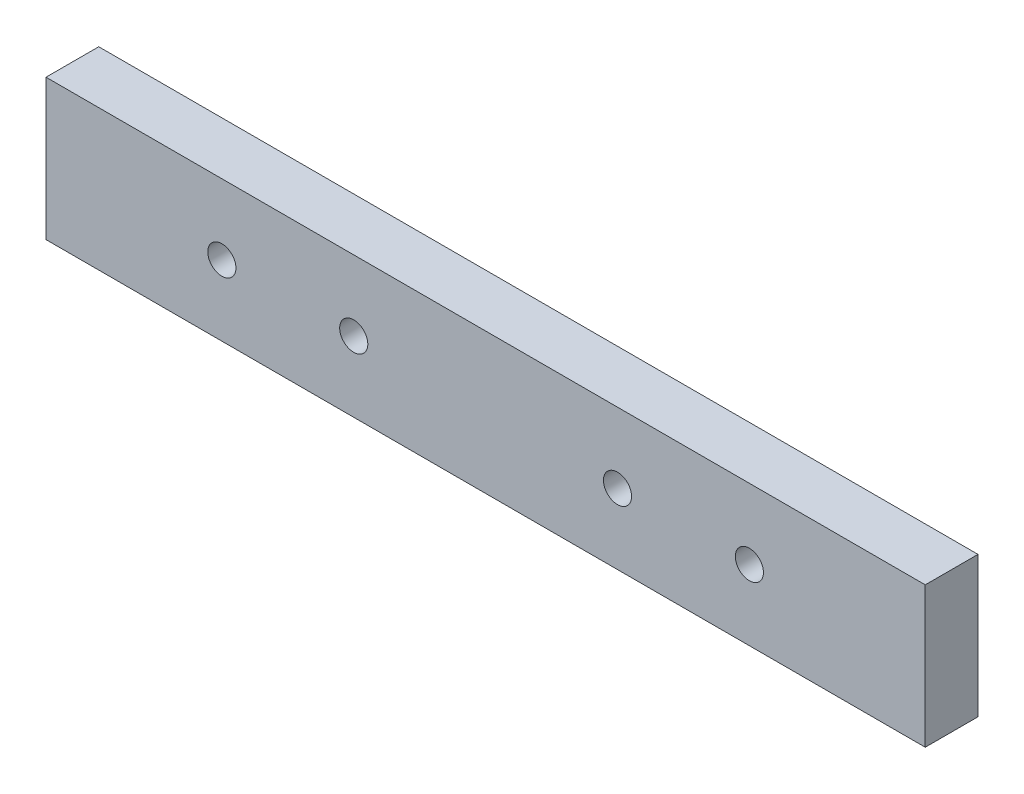
ISO-10303-21;
HEADER;
FILE_DESCRIPTION(('STEP AP214'),'2;1');
FILE_NAME('part.step','',(''),(''),'','','');
FILE_SCHEMA(('AUTOMOTIVE_DESIGN { 1 0 10303 214 1 1 1 1 }'));
ENDSEC;
DATA;
#1=APPLICATION_CONTEXT('core data for automotive mechanical design processes');
#2=APPLICATION_PROTOCOL_DEFINITION('international standard','automotive_design',2000,#1);
#3=PRODUCT_CONTEXT('',#1,'mechanical');
#4=PRODUCT('Part','Part','',(#3));
#5=PRODUCT_RELATED_PRODUCT_CATEGORY('part','',(#4));
#6=PRODUCT_DEFINITION_FORMATION('','',#4);
#7=PRODUCT_DEFINITION_CONTEXT('part definition',#1,'design');
#8=PRODUCT_DEFINITION('design','',#6,#7);
#9=PRODUCT_DEFINITION_SHAPE('','',#8);
#10=(LENGTH_UNIT() NAMED_UNIT(*) SI_UNIT(.MILLI.,.METRE.));
#11=(NAMED_UNIT(*) PLANE_ANGLE_UNIT() SI_UNIT($,.RADIAN.));
#12=(NAMED_UNIT(*) SI_UNIT($,.STERADIAN.) SOLID_ANGLE_UNIT());
#13=UNCERTAINTY_MEASURE_WITH_UNIT(LENGTH_MEASURE(1.E-05),#10,'distance_accuracy_value','');
#14=(GEOMETRIC_REPRESENTATION_CONTEXT(3) GLOBAL_UNCERTAINTY_ASSIGNED_CONTEXT((#13)) GLOBAL_UNIT_ASSIGNED_CONTEXT((#10,
#11,#12)) REPRESENTATION_CONTEXT('',''));
#15=CARTESIAN_POINT('',(0.,0.,0.));
#16=DIRECTION('',(0.,0.,1.));
#17=DIRECTION('',(1.,0.,0.));
#18=AXIS2_PLACEMENT_3D('',#15,#16,#17);
#19=CARTESIAN_POINT('',(0.,0.,6.));
#20=DIRECTION('',(0.,0.,1.));
#21=DIRECTION('',(1.,0.,0.));
#22=AXIS2_PLACEMENT_3D('',#19,#20,#21);
#23=PLANE('',#22);
#24=CARTESIAN_POINT('',(-30.,0.,6.));
#25=DIRECTION('',(0.,0.,1.));
#26=DIRECTION('',(-1.,0.,0.));
#27=AXIS2_PLACEMENT_3D('',#24,#25,#26);
#28=CIRCLE('',#27,1.6);
#29=CARTESIAN_POINT('',(-31.6,0.,6.));
#30=VERTEX_POINT('',#29);
#31=EDGE_CURVE('E123',#30,#30,#28,.T.);
#32=ORIENTED_EDGE('',*,*,#31,.F.);
#33=EDGE_LOOP('',(#32));
#34=FACE_BOUND('',#33,.T.);
#35=CARTESIAN_POINT('',(30.,0.,6.));
#36=DIRECTION('',(0.,0.,1.));
#37=DIRECTION('',(1.,0.,0.));
#38=AXIS2_PLACEMENT_3D('',#35,#36,#37);
#39=CIRCLE('',#38,1.6);
#40=CARTESIAN_POINT('',(31.6,0.,6.));
#41=VERTEX_POINT('',#40);
#42=EDGE_CURVE('E102',#41,#41,#39,.T.);
#43=ORIENTED_EDGE('',*,*,#42,.F.);
#44=EDGE_LOOP('',(#43));
#45=FACE_BOUND('',#44,.T.);
#46=DIRECTION('',(0.,1.,0.));
#47=VECTOR('',#46,1.);
#48=CARTESIAN_POINT('',(50.,8.00000000000001,6.));
#49=LINE('',#48,#47);
#50=CARTESIAN_POINT('',(50.,-7.99999999999999,6.));
#51=VERTEX_POINT('',#50);
#52=CARTESIAN_POINT('',(50.,8.00000000000001,6.));
#53=VERTEX_POINT('',#52);
#54=EDGE_CURVE('E87',#51,#53,#49,.T.);
#55=ORIENTED_EDGE('',*,*,#54,.T.);
#56=DIRECTION('',(-1.,0.,0.));
#57=VECTOR('',#56,1.);
#58=CARTESIAN_POINT('',(-50.,8.00000000000001,6.));
#59=LINE('',#58,#57);
#60=CARTESIAN_POINT('',(-50.,8.00000000000001,6.));
#61=VERTEX_POINT('',#60);
#62=EDGE_CURVE('E82',#53,#61,#59,.T.);
#63=ORIENTED_EDGE('',*,*,#62,.T.);
#64=DIRECTION('',(0.,-1.,0.));
#65=VECTOR('',#64,1.);
#66=CARTESIAN_POINT('',(-50.,8.00000000000001,6.));
#67=LINE('',#66,#65);
#68=CARTESIAN_POINT('',(-50.,-7.99999999999999,6.));
#69=VERTEX_POINT('',#68);
#70=EDGE_CURVE('E85',#61,#69,#67,.T.);
#71=ORIENTED_EDGE('',*,*,#70,.T.);
#72=DIRECTION('',(1.,0.,0.));
#73=VECTOR('',#72,1.);
#74=CARTESIAN_POINT('',(-50.,-7.99999999999999,6.));
#75=LINE('',#74,#73);
#76=EDGE_CURVE('E52',#69,#51,#75,.T.);
#77=ORIENTED_EDGE('',*,*,#76,.T.);
#78=EDGE_LOOP('',(#55,#63,#71,#77));
#79=FACE_BOUND('',#78,.T.);
#80=CARTESIAN_POINT('',(15.,0.,6.));
#81=DIRECTION('',(0.,0.,1.));
#82=DIRECTION('',(1.,0.,0.));
#83=AXIS2_PLACEMENT_3D('',#80,#81,#82);
#84=CIRCLE('',#83,1.6);
#85=CARTESIAN_POINT('',(16.6,0.,6.));
#86=VERTEX_POINT('',#85);
#87=EDGE_CURVE('E117',#86,#86,#84,.T.);
#88=ORIENTED_EDGE('',*,*,#87,.F.);
#89=EDGE_LOOP('',(#88));
#90=FACE_BOUND('',#89,.T.);
#91=CARTESIAN_POINT('',(-15.,0.,6.));
#92=DIRECTION('',(0.,0.,1.));
#93=DIRECTION('',(-1.,0.,0.));
#94=AXIS2_PLACEMENT_3D('',#91,#92,#93);
#95=CIRCLE('',#94,1.6);
#96=CARTESIAN_POINT('',(-16.6,0.,6.));
#97=VERTEX_POINT('',#96);
#98=EDGE_CURVE('E129',#97,#97,#95,.T.);
#99=ORIENTED_EDGE('',*,*,#98,.F.);
#100=EDGE_LOOP('',(#99));
#101=FACE_BOUND('',#100,.T.);
#102=ADVANCED_FACE('F35',(#34,#45,#79,#90,#101),#23,.T.);
#103=CARTESIAN_POINT('',(0.,0.,0.));
#104=DIRECTION('',(0.,0.,1.));
#105=DIRECTION('',(1.,0.,0.));
#106=AXIS2_PLACEMENT_3D('',#103,#104,#105);
#107=PLANE('',#106);
#108=DIRECTION('',(0.,1.,0.));
#109=VECTOR('',#108,1.);
#110=CARTESIAN_POINT('',(50.,8.00000000000001,0.));
#111=LINE('',#110,#109);
#112=CARTESIAN_POINT('',(50.,-7.99999999999999,0.));
#113=VERTEX_POINT('',#112);
#114=CARTESIAN_POINT('',(50.,8.00000000000001,0.));
#115=VERTEX_POINT('',#114);
#116=EDGE_CURVE('E99',#113,#115,#111,.T.);
#117=ORIENTED_EDGE('',*,*,#116,.F.);
#118=DIRECTION('',(1.,0.,0.));
#119=VECTOR('',#118,1.);
#120=CARTESIAN_POINT('',(-50.,-7.99999999999999,0.));
#121=LINE('',#120,#119);
#122=CARTESIAN_POINT('',(-50.,-7.99999999999999,0.));
#123=VERTEX_POINT('',#122);
#124=EDGE_CURVE('E75',#123,#113,#121,.T.);
#125=ORIENTED_EDGE('',*,*,#124,.F.);
#126=DIRECTION('',(0.,-1.,0.));
#127=VECTOR('',#126,1.);
#128=CARTESIAN_POINT('',(-50.,8.00000000000001,0.));
#129=LINE('',#128,#127);
#130=CARTESIAN_POINT('',(-50.,8.00000000000001,0.));
#131=VERTEX_POINT('',#130);
#132=EDGE_CURVE('E69',#131,#123,#129,.T.);
#133=ORIENTED_EDGE('',*,*,#132,.F.);
#134=DIRECTION('',(-1.,0.,0.));
#135=VECTOR('',#134,1.);
#136=CARTESIAN_POINT('',(-50.,8.00000000000001,0.));
#137=LINE('',#136,#135);
#138=EDGE_CURVE('E91',#115,#131,#137,.T.);
#139=ORIENTED_EDGE('',*,*,#138,.F.);
#140=EDGE_LOOP('',(#117,#125,#133,#139));
#141=FACE_BOUND('',#140,.T.);
#142=CARTESIAN_POINT('',(30.,0.,0.));
#143=DIRECTION('',(0.,0.,1.));
#144=DIRECTION('',(1.,0.,0.));
#145=AXIS2_PLACEMENT_3D('',#142,#143,#144);
#146=CIRCLE('',#145,1.6);
#147=CARTESIAN_POINT('',(31.6,0.,0.));
#148=VERTEX_POINT('',#147);
#149=EDGE_CURVE('E114',#148,#148,#146,.T.);
#150=ORIENTED_EDGE('',*,*,#149,.T.);
#151=EDGE_LOOP('',(#150));
#152=FACE_BOUND('',#151,.T.);
#153=CARTESIAN_POINT('',(15.,0.,0.));
#154=DIRECTION('',(0.,0.,1.));
#155=DIRECTION('',(1.,0.,0.));
#156=AXIS2_PLACEMENT_3D('',#153,#154,#155);
#157=CIRCLE('',#156,1.6);
#158=CARTESIAN_POINT('',(16.6,0.,0.));
#159=VERTEX_POINT('',#158);
#160=EDGE_CURVE('E120',#159,#159,#157,.T.);
#161=ORIENTED_EDGE('',*,*,#160,.T.);
#162=EDGE_LOOP('',(#161));
#163=FACE_BOUND('',#162,.T.);
#164=CARTESIAN_POINT('',(-30.,0.,0.));
#165=DIRECTION('',(0.,0.,1.));
#166=DIRECTION('',(-1.,0.,0.));
#167=AXIS2_PLACEMENT_3D('',#164,#165,#166);
#168=CIRCLE('',#167,1.6);
#169=CARTESIAN_POINT('',(-31.6,0.,0.));
#170=VERTEX_POINT('',#169);
#171=EDGE_CURVE('E126',#170,#170,#168,.T.);
#172=ORIENTED_EDGE('',*,*,#171,.T.);
#173=EDGE_LOOP('',(#172));
#174=FACE_BOUND('',#173,.T.);
#175=CARTESIAN_POINT('',(-15.,0.,0.));
#176=DIRECTION('',(0.,0.,1.));
#177=DIRECTION('',(-1.,0.,0.));
#178=AXIS2_PLACEMENT_3D('',#175,#176,#177);
#179=CIRCLE('',#178,1.6);
#180=CARTESIAN_POINT('',(-16.6,0.,0.));
#181=VERTEX_POINT('',#180);
#182=EDGE_CURVE('E132',#181,#181,#179,.T.);
#183=ORIENTED_EDGE('',*,*,#182,.T.);
#184=EDGE_LOOP('',(#183));
#185=FACE_BOUND('',#184,.T.);
#186=ADVANCED_FACE('F110',(#141,#152,#163,#174,#185),#107,.F.);
#187=CARTESIAN_POINT('',(50.,8.00000000000001,6.));
#188=DIRECTION('',(-1.,0.,0.));
#189=DIRECTION('',(0.,-1.,0.));
#190=AXIS2_PLACEMENT_3D('',#187,#188,#189);
#191=PLANE('',#190);
#192=ORIENTED_EDGE('',*,*,#116,.T.);
#193=DIRECTION('',(0.,0.,-1.));
#194=VECTOR('',#193,1.);
#195=CARTESIAN_POINT('',(50.,8.00000000000001,6.));
#196=LINE('',#195,#194);
#197=EDGE_CURVE('E11',#53,#115,#196,.T.);
#198=ORIENTED_EDGE('',*,*,#197,.F.);
#199=ORIENTED_EDGE('',*,*,#54,.F.);
#200=DIRECTION('',(0.,0.,-1.));
#201=VECTOR('',#200,1.);
#202=CARTESIAN_POINT('',(50.,-7.99999999999999,6.));
#203=LINE('',#202,#201);
#204=EDGE_CURVE('E95',#51,#113,#203,.T.);
#205=ORIENTED_EDGE('',*,*,#204,.T.);
#206=EDGE_LOOP('',(#192,#198,#199,#205));
#207=FACE_BOUND('',#206,.T.);
#208=ADVANCED_FACE('F37',(#207),#191,.F.);
#209=CARTESIAN_POINT('',(-50.,8.00000000000001,6.));
#210=DIRECTION('',(0.,-1.,0.));
#211=DIRECTION('',(0.,0.,-1.));
#212=AXIS2_PLACEMENT_3D('',#209,#210,#211);
#213=PLANE('',#212);
#214=ORIENTED_EDGE('',*,*,#138,.T.);
#215=DIRECTION('',(0.,0.,-1.));
#216=VECTOR('',#215,1.);
#217=CARTESIAN_POINT('',(-50.,8.00000000000001,6.));
#218=LINE('',#217,#216);
#219=EDGE_CURVE('E44',#61,#131,#218,.T.);
#220=ORIENTED_EDGE('',*,*,#219,.F.);
#221=ORIENTED_EDGE('',*,*,#62,.F.);
#222=ORIENTED_EDGE('',*,*,#197,.T.);
#223=EDGE_LOOP('',(#214,#220,#221,#222));
#224=FACE_BOUND('',#223,.T.);
#225=ADVANCED_FACE('F90',(#224),#213,.F.);
#226=CARTESIAN_POINT('',(-50.,8.00000000000001,6.));
#227=DIRECTION('',(1.,0.,0.));
#228=DIRECTION('',(0.,0.,-1.));
#229=AXIS2_PLACEMENT_3D('',#226,#227,#228);
#230=PLANE('',#229);
#231=ORIENTED_EDGE('',*,*,#132,.T.);
#232=DIRECTION('',(0.,0.,-1.));
#233=VECTOR('',#232,1.);
#234=CARTESIAN_POINT('',(-50.,-7.99999999999999,6.));
#235=LINE('',#234,#233);
#236=EDGE_CURVE('E92',#69,#123,#235,.T.);
#237=ORIENTED_EDGE('',*,*,#236,.F.);
#238=ORIENTED_EDGE('',*,*,#70,.F.);
#239=ORIENTED_EDGE('',*,*,#219,.T.);
#240=EDGE_LOOP('',(#231,#237,#238,#239));
#241=FACE_BOUND('',#240,.T.);
#242=ADVANCED_FACE('F93',(#241),#230,.F.);
#243=CARTESIAN_POINT('',(-50.,-7.99999999999999,6.));
#244=DIRECTION('',(0.,1.,0.));
#245=DIRECTION('',(0.,0.,1.));
#246=AXIS2_PLACEMENT_3D('',#243,#244,#245);
#247=PLANE('',#246);
#248=ORIENTED_EDGE('',*,*,#124,.T.);
#249=ORIENTED_EDGE('',*,*,#204,.F.);
#250=ORIENTED_EDGE('',*,*,#76,.F.);
#251=ORIENTED_EDGE('',*,*,#236,.T.);
#252=EDGE_LOOP('',(#248,#249,#250,#251));
#253=FACE_BOUND('',#252,.T.);
#254=ADVANCED_FACE('F107',(#253),#247,.F.);
#255=CARTESIAN_POINT('',(30.,0.,6.));
#256=DIRECTION('',(0.,0.,-1.));
#257=DIRECTION('',(-1.,0.,0.));
#258=AXIS2_PLACEMENT_3D('',#255,#256,#257);
#259=CYLINDRICAL_SURFACE('',#258,1.6);
#260=ORIENTED_EDGE('',*,*,#42,.T.);
#261=EDGE_LOOP('',(#260));
#262=FACE_BOUND('',#261,.T.);
#263=ORIENTED_EDGE('',*,*,#149,.F.);
#264=EDGE_LOOP('',(#263));
#265=FACE_BOUND('',#264,.T.);
#266=ADVANCED_FACE('F151',(#262,#265),#259,.F.);
#267=CARTESIAN_POINT('',(15.,0.,6.));
#268=DIRECTION('',(0.,0.,-1.));
#269=DIRECTION('',(-1.,0.,0.));
#270=AXIS2_PLACEMENT_3D('',#267,#268,#269);
#271=CYLINDRICAL_SURFACE('',#270,1.6);
#272=ORIENTED_EDGE('',*,*,#87,.T.);
#273=EDGE_LOOP('',(#272));
#274=FACE_BOUND('',#273,.T.);
#275=ORIENTED_EDGE('',*,*,#160,.F.);
#276=EDGE_LOOP('',(#275));
#277=FACE_BOUND('',#276,.T.);
#278=ADVANCED_FACE('F197',(#274,#277),#271,.F.);
#279=CARTESIAN_POINT('',(-30.,0.,6.));
#280=DIRECTION('',(0.,0.,-1.));
#281=DIRECTION('',(-1.,0.,0.));
#282=AXIS2_PLACEMENT_3D('',#279,#280,#281);
#283=CYLINDRICAL_SURFACE('',#282,1.6);
#284=ORIENTED_EDGE('',*,*,#31,.T.);
#285=EDGE_LOOP('',(#284));
#286=FACE_BOUND('',#285,.T.);
#287=ORIENTED_EDGE('',*,*,#171,.F.);
#288=EDGE_LOOP('',(#287));
#289=FACE_BOUND('',#288,.T.);
#290=ADVANCED_FACE('F205',(#286,#289),#283,.F.);
#291=CARTESIAN_POINT('',(-15.,0.,6.));
#292=DIRECTION('',(0.,0.,-1.));
#293=DIRECTION('',(-1.,0.,0.));
#294=AXIS2_PLACEMENT_3D('',#291,#292,#293);
#295=CYLINDRICAL_SURFACE('',#294,1.6);
#296=ORIENTED_EDGE('',*,*,#98,.T.);
#297=EDGE_LOOP('',(#296));
#298=FACE_BOUND('',#297,.T.);
#299=ORIENTED_EDGE('',*,*,#182,.F.);
#300=EDGE_LOOP('',(#299));
#301=FACE_BOUND('',#300,.T.);
#302=ADVANCED_FACE('F138',(#298,#301),#295,.F.);
#303=CLOSED_SHELL('',(#102,#186,#208,#225,#242,#254,#266,#278,#290,#302));
#304=MANIFOLD_SOLID_BREP('B2',#303);
#305=ADVANCED_BREP_SHAPE_REPRESENTATION('',(#18,#304),#14);
#306=SHAPE_DEFINITION_REPRESENTATION(#9,#305);
ENDSEC;
END-ISO-10303-21;
